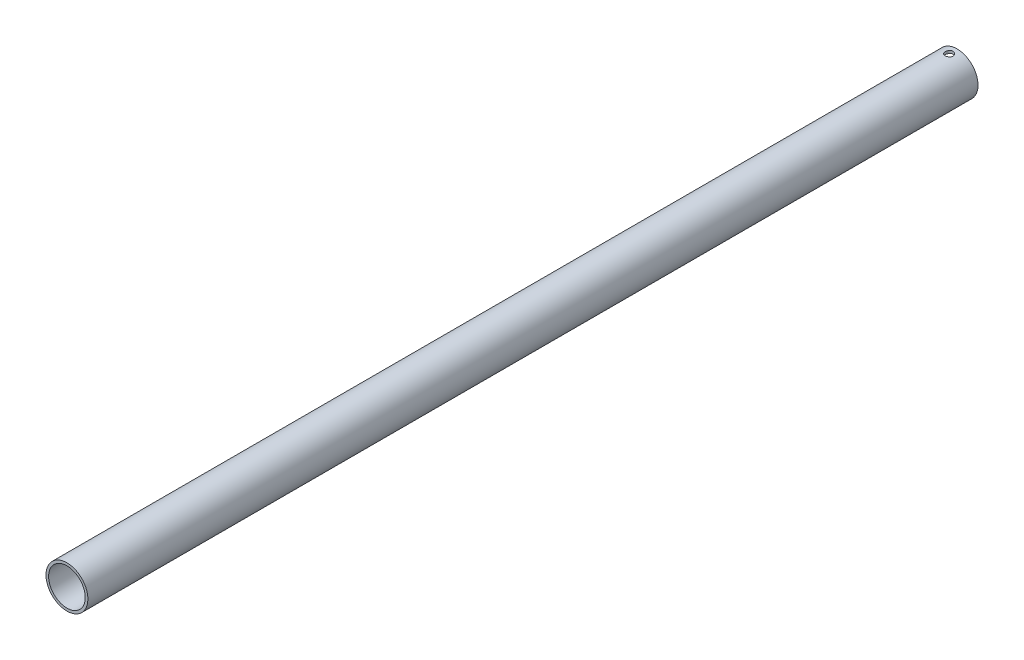
ISO-10303-21;
HEADER;
FILE_DESCRIPTION(('STEP AP214'),'2;1');
FILE_NAME('part.step','',(''),(''),'','','');
FILE_SCHEMA(('AUTOMOTIVE_DESIGN { 1 0 10303 214 1 1 1 1 }'));
ENDSEC;
DATA;
#1=APPLICATION_CONTEXT('core data for automotive mechanical design processes');
#2=APPLICATION_PROTOCOL_DEFINITION('international standard','automotive_design',2000,#1);
#3=PRODUCT_CONTEXT('',#1,'mechanical');
#4=PRODUCT('Part','Part','',(#3));
#5=PRODUCT_RELATED_PRODUCT_CATEGORY('part','',(#4));
#6=PRODUCT_DEFINITION_FORMATION('','',#4);
#7=PRODUCT_DEFINITION_CONTEXT('part definition',#1,'design');
#8=PRODUCT_DEFINITION('design','',#6,#7);
#9=PRODUCT_DEFINITION_SHAPE('','',#8);
#10=(LENGTH_UNIT() NAMED_UNIT(*) SI_UNIT(.MILLI.,.METRE.));
#11=(NAMED_UNIT(*) PLANE_ANGLE_UNIT() SI_UNIT($,.RADIAN.));
#12=(NAMED_UNIT(*) SI_UNIT($,.STERADIAN.) SOLID_ANGLE_UNIT());
#13=UNCERTAINTY_MEASURE_WITH_UNIT(LENGTH_MEASURE(1.E-05),#10,'distance_accuracy_value','');
#14=(GEOMETRIC_REPRESENTATION_CONTEXT(3) GLOBAL_UNCERTAINTY_ASSIGNED_CONTEXT((#13)) GLOBAL_UNIT_ASSIGNED_CONTEXT((#10,
#11,#12)) REPRESENTATION_CONTEXT('',''));
#15=CARTESIAN_POINT('',(0.,0.,0.));
#16=DIRECTION('',(0.,0.,1.));
#17=DIRECTION('',(1.,0.,0.));
#18=AXIS2_PLACEMENT_3D('',#15,#16,#17);
#19=CARTESIAN_POINT('',(0.,0.,240.));
#20=DIRECTION('',(0.,0.,-1.));
#21=DIRECTION('',(0.,1.,0.));
#22=AXIS2_PLACEMENT_3D('',#19,#20,#21);
#23=CYLINDRICAL_SURFACE('',#22,7.);
#24=CARTESIAN_POINT('',(0.,6.99999999999933,-95.44));
#25=CARTESIAN_POINT('',(0.0832358860906152,6.99999846043159,-95.4400028995743));
#26=CARTESIAN_POINT('',(0.166507195600273,6.99850025949644,-95.4469516083879));
#27=CARTESIAN_POINT('',(0.330687344293326,6.99266829827661,-95.4745356568536));
#28=CARTESIAN_POINT('',(0.411594403571189,6.98833245637033,-95.4951810441949));
#29=CARTESIAN_POINT('',(0.568649323817735,6.9773083178876,-95.549484364608));
#30=CARTESIAN_POINT('',(0.644801963446553,6.97062242967104,-95.5831289793813));
#31=CARTESIAN_POINT('',(0.790378177960784,6.95562106817904,-95.6624340861713));
#32=CARTESIAN_POINT('',(0.859801981747366,6.94730565036594,-95.7080941692499));
#33=CARTESIAN_POINT('',(0.991024790535224,6.92981369246244,-95.8108802996735));
#34=CARTESIAN_POINT('',(1.05270503419444,6.92062683143193,-95.8681562218985));
#35=CARTESIAN_POINT('',(1.16566042389434,6.90250069814078,-95.9922263156852));
#36=CARTESIAN_POINT('',(1.21693467150908,6.89356144731564,-96.0590213082512));
#37=CARTESIAN_POINT('',(1.30814204379809,6.87684116047158,-96.2011057528604));
#38=CARTESIAN_POINT('',(1.34794958335009,6.86907336344293,-96.2764775177562));
#39=CARTESIAN_POINT('',(1.41428823691148,6.8557232555847,-96.4330344537669));
#40=CARTESIAN_POINT('',(1.44082087001716,6.85014069470644,-96.5142189584926));
#41=CARTESIAN_POINT('',(1.47946574422454,6.84189808926244,-96.6788110865881));
#42=CARTESIAN_POINT('',(1.49178779748342,6.8391955689642,-96.7621672756639));
#43=CARTESIAN_POINT('',(1.50231395206577,6.83689139845039,-96.929804232507));
#44=CARTESIAN_POINT('',(1.50051971664629,6.83728938291662,-97.0140848901799));
#45=CARTESIAN_POINT('',(1.48303326340861,6.84110276603765,-97.1796246879338));
#46=CARTESIAN_POINT('',(1.46758398649408,6.84446541682095,-97.2609108891002));
#47=CARTESIAN_POINT('',(1.42361054298677,6.85374593375721,-97.4197102402893));
#48=CARTESIAN_POINT('',(1.39508566936466,6.85966393808335,-97.4972231860323));
#49=CARTESIAN_POINT('',(1.32554551075991,6.87344080755657,-97.6469628728733));
#50=CARTESIAN_POINT('',(1.2844361097283,6.88131420983298,-97.7191445127125));
#51=CARTESIAN_POINT('',(1.19096007283993,6.89810572501221,-97.855675164958));
#52=CARTESIAN_POINT('',(1.13859196103562,6.90702397481829,-97.9200231486862));
#53=CARTESIAN_POINT('',(1.0227954275532,6.92512718393811,-98.0404593556734));
#54=CARTESIAN_POINT('',(0.95916023396441,6.93431383972111,-98.0963487065847));
#55=CARTESIAN_POINT('',(0.823317306269097,6.95175017496992,-98.1966937336897));
#56=CARTESIAN_POINT('',(0.751109428775401,6.95999983875905,-98.2411492186004));
#57=CARTESIAN_POINT('',(0.599933462049961,6.97465778533936,-98.3174106799069));
#58=CARTESIAN_POINT('',(0.520952258863484,6.98106238643287,-98.349191412578));
#59=CARTESIAN_POINT('',(0.358603146685708,6.99128109245267,-98.3989756483211));
#60=CARTESIAN_POINT('',(0.275235851133671,6.99509555860316,-98.4169810725633));
#61=CARTESIAN_POINT('',(0.108187670836632,6.99965306347741,-98.4384162141434));
#62=CARTESIAN_POINT('',(0.0245431772716172,7.00045336520999,-98.4421177128818));
#63=CARTESIAN_POINT('',(-0.142168973650402,6.99905248935902,-98.4355754288748));
#64=CARTESIAN_POINT('',(-0.225236668127253,6.99685150675631,-98.425332552037));
#65=CARTESIAN_POINT('',(-0.387542537982803,6.98973143045199,-98.3914177563383));
#66=CARTESIAN_POINT('',(-0.466811712908474,6.98484105045392,-98.3678876305275));
#67=CARTESIAN_POINT('',(-0.620278450473415,6.97288924421443,-98.3082230570052));
#68=CARTESIAN_POINT('',(-0.694475592587738,6.9658276382217,-98.2720875656883));
#69=CARTESIAN_POINT('',(-0.836821397964753,6.95017504390333,-98.1876664569397));
#70=CARTESIAN_POINT('',(-0.904872575111139,6.94156431354208,-98.1392202050903));
#71=CARTESIAN_POINT('',(-1.0319769255236,6.9238103303478,-98.0317651751113));
#72=CARTESIAN_POINT('',(-1.091028978692,6.9146670114203,-97.9727550841126));
#73=CARTESIAN_POINT('',(-1.19952711057989,6.89668172706257,-97.8446026298129));
#74=CARTESIAN_POINT('',(-1.24878537255157,6.88784792221218,-97.7752999007779));
#75=CARTESIAN_POINT('',(-1.33496415386041,6.87166654559614,-97.629245403522));
#76=CARTESIAN_POINT('',(-1.37188519913706,6.86431891047988,-97.5524939530225));
#77=CARTESIAN_POINT('',(-1.43209741248548,6.85201009807323,-97.3941277010054));
#78=CARTESIAN_POINT('',(-1.45546398641275,6.847035745829,-97.3125426435693));
#79=CARTESIAN_POINT('',(-1.48812696085335,6.84001186708351,-97.1464844161664));
#80=CARTESIAN_POINT('',(-1.49742550780258,6.83796189439639,-97.0620116887987));
#81=CARTESIAN_POINT('',(-1.5015999992604,6.83704618848089,-96.8944676568247));
#82=CARTESIAN_POINT('',(-1.49677347258311,6.83811476518476,-96.8114039850194));
#83=CARTESIAN_POINT('',(-1.4734978940633,6.84316763184764,-96.6473027578674));
#84=CARTESIAN_POINT('',(-1.45504898957979,6.84715189026647,-96.5662651806134));
#85=CARTESIAN_POINT('',(-1.40519345940433,6.85755581104091,-96.4087413421308));
#86=CARTESIAN_POINT('',(-1.37382847170886,6.86396764224636,-96.3322413513357));
#87=CARTESIAN_POINT('',(-1.299067515956,6.87850764590582,-96.1855446274931));
#88=CARTESIAN_POINT('',(-1.25567035301499,6.88663598880296,-96.1153485213849));
#89=CARTESIAN_POINT('',(-1.15708290349303,6.90389055593165,-95.9817818062746));
#90=CARTESIAN_POINT('',(-1.10167987421236,6.9130330993886,-95.918570304053));
#91=CARTESIAN_POINT('',(-0.98108655461962,6.93117449799628,-95.8022437374795));
#92=CARTESIAN_POINT('',(-0.915894009385598,6.9401733195123,-95.7491310056878));
#93=CARTESIAN_POINT('',(-0.776603147268723,6.9571449104892,-95.6538840404944));
#94=CARTESIAN_POINT('',(-0.70240484600965,6.9651036457056,-95.611893393769));
#95=CARTESIAN_POINT('',(-0.547850160940609,6.97895826103952,-95.5410454710938));
#96=CARTESIAN_POINT('',(-0.46749910586389,6.98485590212276,-95.512176977415));
#97=CARTESIAN_POINT('',(-0.322535217553211,6.99284848461705,-95.4736478148689));
#98=CARTESIAN_POINT('',(-0.258717205545984,6.99551391888197,-95.46105356602));
#99=CARTESIAN_POINT('',(-0.129939960853849,6.99909024154653,-95.4442286982883));
#100=CARTESIAN_POINT('',(-0.064980775088747,7.00000120191248,-95.4399977363539));
#101=CARTESIAN_POINT('',(0.,6.99999999999933,-95.44));
#102=B_SPLINE_CURVE_WITH_KNOTS('',3,(#24,#25,#26,#27,#28,#29,#30,#31,#32,#33,#34,#35,#36,#37,
#38,#39,#40,#41,#42,#43,#44,#45,#46,#47,#48,#49,#50,#51,#52,#53,#54,#55,#56,#57,#58,#59,#60,#61,
#62,#63,#64,#65,#66,#67,#68,#69,#70,#71,#72,#73,#74,#75,#76,#77,#78,#79,#80,#81,#82,#83,#84,#85,
#86,#87,#88,#89,#90,#91,#92,#93,#94,#95,#96,#97,#98,#99,#100,#101),.UNSPECIFIED.,.T.,.F.,(4,2,2,
2,2,2,2,2,2,2,2,2,2,2,2,2,2,2,2,2,2,2,2,2,2,2,2,2,2,2,2,2,2,2,2,2,2,2,4),(0.,0.249469836512082,
0.499122883219935,0.748520824425598,0.99791027864588,1.25074961881731,1.50361077918506,
1.75914429214511,2.01464855677492,2.26633008124666,2.51798195169165,2.76524475452929,
3.01252092904568,3.26169356165967,3.51089887920889,3.76527011050291,4.0196455970235,
4.27452521139806,4.52936927256343,4.77934665704185,5.02930780231429,5.27665060589267,
5.52401389198434,5.77478733867803,6.02559197304485,6.28082063283534,6.53603841075806,
6.78982240408475,7.04356767229186,7.29200680540296,7.5404432510827,7.78808499706786,
8.03575134451625,8.28822950154114,8.54076590397114,8.79641910357221,9.0518533401027,
9.24661799132293,9.44137465337336),.UNSPECIFIED.);
#103=CARTESIAN_POINT('',(0.,6.99999999999933,-95.44));
#104=VERTEX_POINT('',#103);
#105=EDGE_CURVE('E85',#104,#104,#102,.T.);
#106=ORIENTED_EDGE('',*,*,#105,.T.);
#107=EDGE_LOOP('',(#106));
#108=FACE_BOUND('',#107,.T.);
#109=CARTESIAN_POINT('',(0.,-3.79690197153943E-13,-100.));
#110=DIRECTION('',(0.,0.,-1.));
#111=DIRECTION('',(0.,1.,0.));
#112=AXIS2_PLACEMENT_3D('',#109,#110,#111);
#113=CIRCLE('',#112,7.);
#114=CARTESIAN_POINT('',(0.,6.99999999999962,-100.));
#115=VERTEX_POINT('',#114);
#116=EDGE_CURVE('E91',#115,#115,#113,.T.);
#117=ORIENTED_EDGE('',*,*,#116,.T.);
#118=EDGE_LOOP('',(#117));
#119=FACE_BOUND('',#118,.T.);
#120=CARTESIAN_POINT('',(-1.5,-6.83739716558934,-96.94));
#121=CARTESIAN_POINT('',(-1.49999708238613,-6.83739884559018,-97.0232111524819));
#122=CARTESIAN_POINT('',(-1.49305236244768,-6.83893272341996,-97.1064577739421));
#123=CARTESIAN_POINT('',(-1.46548559252999,-6.84489178429934,-97.270586672242));
#124=CARTESIAN_POINT('',(-1.44485339653621,-6.84931911211908,-97.3514671486762));
#125=CARTESIAN_POINT('',(-1.39058863684599,-6.86054115293476,-97.5084657495742));
#126=CARTESIAN_POINT('',(-1.35697000991314,-6.86733332725892,-97.5845888781215));
#127=CARTESIAN_POINT('',(-1.2777261767334,-6.88251670848711,-97.7301152739446));
#128=CARTESIAN_POINT('',(-1.23210132048775,-6.89090786877612,-97.7995187370291));
#129=CARTESIAN_POINT('',(-1.1293514257022,-6.90849578796721,-97.9307629614821));
#130=CARTESIAN_POINT('',(-1.07206859483982,-6.9177024987182,-97.99247887624));
#131=CARTESIAN_POINT('',(-0.947969508129571,-6.93579691710464,-98.1055035544058));
#132=CARTESIAN_POINT('',(-0.88115253021767,-6.94468460051484,-98.1568115288601));
#133=CARTESIAN_POINT('',(-0.739047288464578,-6.96124769109499,-98.2480554444914));
#134=CARTESIAN_POINT('',(-0.66368048822995,-6.96890998819496,-98.2878716557706));
#135=CARTESIAN_POINT('',(-0.507134269342593,-6.98204671043001,-98.3542276914463));
#136=CARTESIAN_POINT('',(-0.425955477380311,-6.98752137103396,-98.3807689447863));
#137=CARTESIAN_POINT('',(-0.261387187671511,-6.99559565281247,-98.4194299709313));
#138=CARTESIAN_POINT('',(-0.178049400596922,-6.99823733378452,-98.4317609285524));
#139=CARTESIAN_POINT('',(-0.0104489453066434,-7.00049362207069,-98.4423112773133));
#140=CARTESIAN_POINT('',(0.0738136201647602,-7.00010856232766,-98.4405322205607));
#141=CARTESIAN_POINT('',(0.239417029250513,-6.99638700862625,-98.4230710353364));
#142=CARTESIAN_POINT('',(0.320783115362115,-6.99309883152499,-98.4076164997101));
#143=CARTESIAN_POINT('',(0.479739463978392,-6.98399541589172,-98.3636053181481));
#144=CARTESIAN_POINT('',(0.557329560175057,-6.97818006616585,-98.3350480957002));
#145=CARTESIAN_POINT('',(0.707167497556558,-6.96459754646925,-98.2654385411115));
#146=CARTESIAN_POINT('',(0.779373657015797,-6.95681685804013,-98.2242992327956));
#147=CARTESIAN_POINT('',(0.915940926562853,-6.94015793743932,-98.1307580318364));
#148=CARTESIAN_POINT('',(0.980301006451531,-6.9312795614476,-98.0783546626997));
#149=CARTESIAN_POINT('',(1.10070208800198,-6.91319326460992,-97.9625314554721));
#150=CARTESIAN_POINT('',(1.15655117320251,-6.9039823037292,-97.898912420643));
#151=CARTESIAN_POINT('',(1.25682243234728,-6.88643566832041,-97.7631167149315));
#152=CARTESIAN_POINT('',(1.30124432118069,-6.87810001563453,-97.6909398305947));
#153=CARTESIAN_POINT('',(1.37748077573297,-6.8632402358679,-97.5397754989362));
#154=CARTESIAN_POINT('',(1.40926035088923,-6.85672115127842,-97.4607698761476));
#155=CARTESIAN_POINT('',(1.45903495159115,-6.84630340806683,-97.2983672340536));
#156=CARTESIAN_POINT('',(1.47703206694628,-6.8424043521855,-97.2149708825568));
#157=CARTESIAN_POINT('',(1.49843586024652,-6.83774881255513,-97.0479042473503));
#158=CARTESIAN_POINT('',(1.5021214192864,-6.83693227051768,-96.9642713249227));
#159=CARTESIAN_POINT('',(1.49555139642373,-6.8383723957406,-96.7975860068183));
#160=CARTESIAN_POINT('',(1.48529673081635,-6.84062886101129,-96.7145335733464));
#161=CARTESIAN_POINT('',(1.45137894635584,-6.84790415484272,-96.5523295650192));
#162=CARTESIAN_POINT('',(1.42786830251553,-6.85289155274431,-96.473144567403));
#163=CARTESIAN_POINT('',(1.36827052946749,-6.86503859869844,-96.3198376624671));
#164=CARTESIAN_POINT('',(1.33218223662818,-6.87219844772916,-96.2457162243658));
#165=CARTESIAN_POINT('',(1.24783504416705,-6.88801634080412,-96.1034303152411));
#166=CARTESIAN_POINT('',(1.19940368590792,-6.89669501746383,-96.0353704179878));
#167=CARTESIAN_POINT('',(1.091971838336,-6.91451775360206,-95.9082416541262));
#168=CARTESIAN_POINT('',(1.03297009182161,-6.92366186834528,-95.8491738585515));
#169=CARTESIAN_POINT('',(0.904812764420809,-6.9415823999024,-95.7406296970552));
#170=CARTESIAN_POINT('',(0.835494925828762,-6.95034935607813,-95.691343083843));
#171=CARTESIAN_POINT('',(0.689401481282266,-6.96635610714968,-95.605114590649));
#172=CARTESIAN_POINT('',(0.61262621604373,-6.97359597176759,-95.5681721470272));
#173=CARTESIAN_POINT('',(0.454265418982032,-6.98569278381641,-95.5079479453615));
#174=CARTESIAN_POINT('',(0.372713193075164,-6.99056443803764,-95.4845816962537));
#175=CARTESIAN_POINT('',(0.206725177003281,-6.99743939302047,-95.4519082942677));
#176=CARTESIAN_POINT('',(0.122289789973985,-6.99944309312362,-95.4425991840261));
#177=CARTESIAN_POINT('',(-0.0452637170528369,-7.00034511009123,-95.4383893475881));
#178=CARTESIAN_POINT('',(-0.128374505509237,-6.99930459001734,-95.4432048413954));
#179=CARTESIAN_POINT('',(-0.292572938415966,-6.99436552363449,-95.466474763519));
#180=CARTESIAN_POINT('',(-0.37366061640529,-6.99046702473752,-95.4849289655783));
#181=CARTESIAN_POINT('',(-0.531301948487272,-6.98025388638603,-95.5348188062495));
#182=CARTESIAN_POINT('',(-0.607868365073178,-6.97394646430559,-95.5662156893856));
#183=CARTESIAN_POINT('',(-0.754684956723221,-6.95959036050727,-95.6410612711691));
#184=CARTESIAN_POINT('',(-0.824934544796144,-6.95154151720407,-95.684511088306));
#185=CARTESIAN_POINT('',(-0.95851230689525,-6.9343980993456,-95.7831623187427));
#186=CARTESIAN_POINT('',(-1.02169036510578,-6.92528708907941,-95.8385641583213));
#187=CARTESIAN_POINT('',(-1.13795001457643,-6.90713690075903,-95.9591406102503));
#188=CARTESIAN_POINT('',(-1.19102918062422,-6.89809774045749,-96.0243175633556));
#189=CARTESIAN_POINT('',(-1.28623261596675,-6.88098693651982,-96.1635904931857));
#190=CARTESIAN_POINT('',(-1.32820897809617,-6.872929059566,-96.237789358287));
#191=CARTESIAN_POINT('',(-1.39903004659826,-6.85886497228115,-96.3923437209233));
#192=CARTESIAN_POINT('',(-1.42788606423931,-6.8528569958164,-96.4726938452531));
#193=CARTESIAN_POINT('',(-1.46638607121558,-6.84470560642063,-96.6176261311859));
#194=CARTESIAN_POINT('',(-1.47896752507743,-6.84198283088019,-96.6814116757078));
#195=CARTESIAN_POINT('',(-1.49577544043437,-6.83832799504472,-96.8101243115773));
#196=CARTESIAN_POINT('',(-1.50000227727981,-6.83739585430136,-96.8750513515083));
#197=CARTESIAN_POINT('',(-1.5,-6.83739716558934,-96.94));
#198=B_SPLINE_CURVE_WITH_KNOTS('',3,(#120,#121,#122,#123,#124,#125,#126,#127,#128,#129,#130,
#131,#132,#133,#134,#135,#136,#137,#138,#139,#140,#141,#142,#143,#144,#145,#146,#147,#148,#149,
#150,#151,#152,#153,#154,#155,#156,#157,#158,#159,#160,#161,#162,#163,#164,#165,#166,#167,#168,
#169,#170,#171,#172,#173,#174,#175,#176,#177,#178,#179,#180,#181,#182,#183,#184,#185,#186,#187,
#188,#189,#190,#191,#192,#193,#194,#195,#196,#197),.UNSPECIFIED.,.T.,.F.,(4,2,2,2,2,2,2,2,2,2,2,
2,2,2,2,2,2,2,2,2,2,2,2,2,2,2,2,2,2,2,2,2,2,2,2,2,2,2,4),(0.,0.249395482027555,
0.498976038479968,0.748289491152764,0.997595676735293,1.25053229582693,1.50348808112879,
1.75899134820279,2.01446710646268,2.26609508151929,2.51769537777241,2.76518557667372,
3.01268666607584,3.26193888143438,3.51122378872315,3.76548960779295,4.01976177023092,
4.27473287411779,4.52966530953839,4.77960433192523,5.02952692653916,5.27663180749376,
5.5237595556315,5.77455010216317,6.02537049659078,6.2806621468321,6.53594213875542,
6.78961589824376,7.04325433208539,7.29183199644127,7.54040553715099,7.78824009619482,
8.03609766151365,8.28848914160965,8.54094115631233,8.79660380167249,9.05204561611688,
9.24671456122271,9.44137476018022),.UNSPECIFIED.);
#199=CARTESIAN_POINT('',(-1.5,-6.83739716558934,-96.94));
#200=VERTEX_POINT('',#199);
#201=EDGE_CURVE('E44',#200,#200,#198,.T.);
#202=ORIENTED_EDGE('',*,*,#201,.T.);
#203=EDGE_LOOP('',(#202));
#204=FACE_BOUND('',#203,.T.);
#205=CARTESIAN_POINT('',(0.,0.,240.));
#206=DIRECTION('',(0.,0.,-1.));
#207=DIRECTION('',(0.,1.,0.));
#208=AXIS2_PLACEMENT_3D('',#205,#206,#207);
#209=CIRCLE('',#208,7.);
#210=CARTESIAN_POINT('',(0.,7.,240.));
#211=VERTEX_POINT('',#210);
#212=EDGE_CURVE('E92',#211,#211,#209,.T.);
#213=ORIENTED_EDGE('',*,*,#212,.F.);
#214=EDGE_LOOP('',(#213));
#215=FACE_BOUND('',#214,.T.);
#216=ADVANCED_FACE('F40',(#108,#119,#204,#215),#23,.F.);
#217=CARTESIAN_POINT('',(-8.096,-8.096,240.));
#218=DIRECTION('',(0.,0.,1.));
#219=DIRECTION('',(1.,0.,0.));
#220=AXIS2_PLACEMENT_3D('',#217,#218,#219);
#221=PLANE('',#220);
#222=CARTESIAN_POINT('',(0.,0.,240.));
#223=DIRECTION('',(0.,0.,-1.));
#224=DIRECTION('',(0.,1.,0.));
#225=AXIS2_PLACEMENT_3D('',#222,#223,#224);
#226=CIRCLE('',#225,8.);
#227=CARTESIAN_POINT('',(0.,8.,240.));
#228=VERTEX_POINT('',#227);
#229=EDGE_CURVE('E97',#228,#228,#226,.T.);
#230=ORIENTED_EDGE('',*,*,#229,.F.);
#231=EDGE_LOOP('',(#230));
#232=FACE_BOUND('',#231,.T.);
#233=ORIENTED_EDGE('',*,*,#212,.T.);
#234=EDGE_LOOP('',(#233));
#235=FACE_BOUND('',#234,.T.);
#236=ADVANCED_FACE('F75',(#232,#235),#221,.T.);
#237=CARTESIAN_POINT('',(0.,6.83040772669209,-96.94));
#238=DIRECTION('',(0.,1.,0.));
#239=DIRECTION('',(0.,0.,1.));
#240=AXIS2_PLACEMENT_3D('',#237,#238,#239);
#241=CYLINDRICAL_SURFACE('',#240,1.5);
#242=ORIENTED_EDGE('',*,*,#105,.F.);
#243=EDGE_LOOP('',(#242));
#244=FACE_BOUND('',#243,.T.);
#245=CARTESIAN_POINT('',(0.,7.99999999999941,-98.44));
#246=CARTESIAN_POINT('',(0.0834717464654703,7.99999848833793,-98.4399968104117));
#247=CARTESIAN_POINT('',(0.166984992730098,7.99868009921656,-98.4330089233806));
#248=CARTESIAN_POINT('',(0.331658129841797,7.99354785890461,-98.4052600048816));
#249=CARTESIAN_POINT('',(0.412815974152226,7.98973190166838,-98.3844873493603));
#250=CARTESIAN_POINT('',(0.570372961851802,7.98003138765399,-98.3298272987407));
#251=CARTESIAN_POINT('',(0.646776330685344,7.97414869946424,-98.2959517475475));
#252=CARTESIAN_POINT('',(0.792807973094008,7.96095710599725,-98.2160811230772));
#253=CARTESIAN_POINT('',(0.862436794477326,7.95364831618231,-98.1700870308552));
#254=CARTESIAN_POINT('',(0.993783715930507,7.93831336430446,-98.0667002319963));
#255=CARTESIAN_POINT('',(1.05540895503184,7.93028034856293,-98.0091905553299));
#256=CARTESIAN_POINT('',(1.16819606135369,7.91445318458592,-97.8846566909124));
#257=CARTESIAN_POINT('',(1.21935717689242,7.90665905354469,-97.8176318202307));
#258=CARTESIAN_POINT('',(1.31014998665793,7.89212551244947,-97.675313911636));
#259=CARTESIAN_POINT('',(1.34968721969606,7.88539493886123,-97.5999596296828));
#260=CARTESIAN_POINT('',(1.41550524332283,7.87384713211929,-97.4435310848232));
#261=CARTESIAN_POINT('',(1.44178717713098,7.86902973396904,-97.3624573158888));
#262=CARTESIAN_POINT('',(1.480050535035,7.86192269574492,-97.1978847690856));
#263=CARTESIAN_POINT('',(1.49219390192039,7.85960445366346,-97.1144249027965));
#264=CARTESIAN_POINT('',(1.50233808095346,7.85767197152703,-96.9466226151917));
#265=CARTESIAN_POINT('',(1.50034016135374,7.85805748898701,-96.8622802736977));
#266=CARTESIAN_POINT('',(1.48238979602362,7.86146292701694,-96.6962804747339));
#267=CARTESIAN_POINT('',(1.46662149996045,7.86444808147276,-96.6146022856998));
#268=CARTESIAN_POINT('',(1.42186799396207,7.87266183284608,-96.4550715802174));
#269=CARTESIAN_POINT('',(1.39288222239499,7.87789052509458,-96.3772192264907));
#270=CARTESIAN_POINT('',(1.322336471793,7.8900385529253,-96.2270113209997));
#271=CARTESIAN_POINT('',(1.28070213532456,7.89696783823307,-96.1546915294192));
#272=CARTESIAN_POINT('',(1.18609368930416,7.9117297160286,-96.0179952714598));
#273=CARTESIAN_POINT('',(1.13311842889266,7.91956240015464,-95.9536196122852));
#274=CARTESIAN_POINT('',(1.01633905685297,7.93540001272106,-95.8335750443275));
#275=CARTESIAN_POINT('',(0.952377436860679,7.94340571023972,-95.7780593475483));
#276=CARTESIAN_POINT('',(0.815968037098827,7.9585738610826,-95.6785227593246));
#277=CARTESIAN_POINT('',(0.743520172255771,7.96573630595187,-95.6345019831296));
#278=CARTESIAN_POINT('',(0.592034988874671,7.9784253967745,-95.55918224613));
#279=CARTESIAN_POINT('',(0.512989564446496,7.98394999136231,-95.5278992208821));
#280=CARTESIAN_POINT('',(0.350639115398697,7.99272505402661,-95.4790979069078));
#281=CARTESIAN_POINT('',(0.267334544277787,7.99597576367936,-95.4615781559546));
#282=CARTESIAN_POINT('',(0.100148652903384,7.99980360641922,-95.4410139689817));
#283=CARTESIAN_POINT('',(0.0162940126341336,8.00041950912221,-95.4377596084703));
#284=CARTESIAN_POINT('',(-0.150761248092186,7.9990154359817,-95.4452554795476));
#285=CARTESIAN_POINT('',(-0.233961900480388,7.99699558964373,-95.4560050230653));
#286=CARTESIAN_POINT('',(-0.396681573218219,7.99057111500348,-95.4910290351834));
#287=CARTESIAN_POINT('',(-0.476224261046065,7.98618522373973,-95.5151972825378));
#288=CARTESIAN_POINT('',(-0.630128631824635,7.9755184221244,-95.5762577067788));
#289=CARTESIAN_POINT('',(-0.704489962595105,7.96923738311276,-95.6131507475658));
#290=CARTESIAN_POINT('',(-0.846816671513212,7.95538030357608,-95.6990781281595));
#291=CARTESIAN_POINT('',(-0.914703277015114,7.94779086174504,-95.7482407385368));
#292=CARTESIAN_POINT('',(-1.04133832326454,7.93219343489653,-95.8571381373624));
#293=CARTESIAN_POINT('',(-1.10008590976086,7.92418541084629,-95.9168739130013));
#294=CARTESIAN_POINT('',(-1.20757295872048,7.90852475697392,-96.0461723189114));
#295=CARTESIAN_POINT('',(-1.25616916218577,7.90087825860199,-96.1158549081254));
#296=CARTESIAN_POINT('',(-1.34096675057787,7.88692985578474,-96.2625176245238));
#297=CARTESIAN_POINT('',(-1.37716859613924,7.88062790137291,-96.3394974803705));
#298=CARTESIAN_POINT('',(-1.43594673512823,7.87013024209515,-96.4982058672425));
#299=CARTESIAN_POINT('',(-1.45858868794786,7.8659244043682,-96.5799093795594));
#300=CARTESIAN_POINT('',(-1.48980679326235,7.86007203802357,-96.7460472225214));
#301=CARTESIAN_POINT('',(-1.49838453270708,7.85842522065731,-96.8304812439704));
#302=CARTESIAN_POINT('',(-1.50117762148355,7.85789199803799,-96.9982483314415));
#303=CARTESIAN_POINT('',(-1.49561895003499,7.85896215974235,-97.081577580957));
#304=CARTESIAN_POINT('',(-1.47079175378803,7.8636460065994,-97.2460914220453));
#305=CARTESIAN_POINT('',(-1.45152331089332,7.86725967655688,-97.3272760264274));
#306=CARTESIAN_POINT('',(-1.39991887583263,7.87660508023121,-97.4850744847955));
#307=CARTESIAN_POINT('',(-1.36760735397253,7.88233284594906,-97.5616965913457));
#308=CARTESIAN_POINT('',(-1.29085868912205,7.89526387551781,-97.7084682542408));
#309=CARTESIAN_POINT('',(-1.24642068948187,7.90246724360061,-97.7786173528448));
#310=CARTESIAN_POINT('',(-1.14589487339536,7.91767266107686,-97.9115836800423));
#311=CARTESIAN_POINT('',(-1.08964259864304,7.92568505352985,-97.9742754125671));
#312=CARTESIAN_POINT('',(-0.967427926742295,7.94152833918677,-98.0894051624645));
#313=CARTESIAN_POINT('',(-0.90146330189162,7.94935919027269,-98.1418408209801));
#314=CARTESIAN_POINT('',(-0.760984945071876,7.9640397596799,-98.235410952627));
#315=CARTESIAN_POINT('',(-0.686399590640518,7.97088000990502,-98.2764394284906));
#316=CARTESIAN_POINT('',(-0.53129011365383,7.98271619380628,-98.3453176366051));
#317=CARTESIAN_POINT('',(-0.450771651705242,7.98771385878978,-98.3731797470469));
#318=CARTESIAN_POINT('',(-0.308347202825147,7.99428290707573,-98.4092773144187));
#319=CARTESIAN_POINT('',(-0.247273810251866,7.99641470878148,-98.4207786303128));
#320=CARTESIAN_POINT('',(-0.124141247115156,7.99927379953952,-98.4361410621164));
#321=CARTESIAN_POINT('',(-0.0620821016527088,8.00000112429746,-98.4400023722559));
#322=CARTESIAN_POINT('',(0.,7.99999999999941,-98.44));
#323=B_SPLINE_CURVE_WITH_KNOTS('',3,(#245,#246,#247,#248,#249,#250,#251,#252,#253,#254,#255,
#256,#257,#258,#259,#260,#261,#262,#263,#264,#265,#266,#267,#268,#269,#270,#271,#272,#273,#274,
#275,#276,#277,#278,#279,#280,#281,#282,#283,#284,#285,#286,#287,#288,#289,#290,#291,#292,#293,
#294,#295,#296,#297,#298,#299,#300,#301,#302,#303,#304,#305,#306,#307,#308,#309,#310,#311,#312,
#313,#314,#315,#316,#317,#318,#319,#320,#321,#322),.UNSPECIFIED.,.T.,.F.,(4,2,2,2,2,2,2,2,2,2,2,
2,2,2,2,2,2,2,2,2,2,2,2,2,2,2,2,2,2,2,2,2,2,2,2,2,2,2,4),(0.,0.250188200964925,
0.500587642535452,0.750761271230907,1.00091465336891,1.25375118013632,1.50660586283617,
1.76146190504358,2.01629596311948,2.26818151445336,2.52004447587256,2.76859000612767,
3.01714609846787,3.2671926262953,3.5172645404986,3.77127768464077,4.02529337544947,
4.27962588321699,4.53393136673745,4.78448174076097,5.03501980464584,5.28360233907829,
5.53220175338032,5.78351778017708,6.03485728413098,6.289534369873,6.54420198954946,
6.7976262781856,7.05102196946513,7.30039252231747,7.54976158541506,7.7986649620769,
8.04758592655422,8.30023369966379,8.55293951262255,8.80792048916315,9.06266126931174,
9.24874344524409,9.4348208903954),.UNSPECIFIED.);
#324=CARTESIAN_POINT('',(0.,7.99999999999941,-98.44));
#325=VERTEX_POINT('',#324);
#326=EDGE_CURVE('E56',#325,#325,#323,.T.);
#327=ORIENTED_EDGE('',*,*,#326,.F.);
#328=EDGE_LOOP('',(#327));
#329=FACE_BOUND('',#328,.T.);
#330=ADVANCED_FACE('F78',(#244,#329),#241,.F.);
#331=CARTESIAN_POINT('',(-8.096,-8.09599999999991,-100.));
#332=DIRECTION('',(0.,0.,1.));
#333=DIRECTION('',(1.,0.,0.));
#334=AXIS2_PLACEMENT_3D('',#331,#332,#333);
#335=PLANE('',#334);
#336=CARTESIAN_POINT('',(0.,-3.20213963691881E-13,-100.));
#337=DIRECTION('',(0.,0.,-1.));
#338=DIRECTION('',(0.,1.,0.));
#339=AXIS2_PLACEMENT_3D('',#336,#337,#338);
#340=CIRCLE('',#339,8.);
#341=CARTESIAN_POINT('',(0.,7.99999999999968,-100.));
#342=VERTEX_POINT('',#341);
#343=EDGE_CURVE('E52',#342,#342,#340,.F.);
#344=ORIENTED_EDGE('',*,*,#343,.F.);
#345=EDGE_LOOP('',(#344));
#346=FACE_BOUND('',#345,.T.);
#347=ORIENTED_EDGE('',*,*,#116,.F.);
#348=EDGE_LOOP('',(#347));
#349=FACE_BOUND('',#348,.T.);
#350=ADVANCED_FACE('F42',(#346,#349),#335,.F.);
#351=CARTESIAN_POINT('',(0.,-8.00697569950275,-96.94));
#352=DIRECTION('',(0.,1.,0.));
#353=DIRECTION('',(-1.,0.,0.));
#354=AXIS2_PLACEMENT_3D('',#351,#352,#353);
#355=CYLINDRICAL_SURFACE('',#354,1.5);
#356=CARTESIAN_POINT('',(-1.5,-7.85811682275144,-96.94));
#357=CARTESIAN_POINT('',(-1.49999679883246,-7.85811843793552,-96.8565427919883));
#358=CARTESIAN_POINT('',(-1.49301126348936,-7.85946079760325,-96.7730440517816));
#359=CARTESIAN_POINT('',(-1.46527253251805,-7.86467851014423,-96.6084010384181));
#360=CARTESIAN_POINT('',(-1.44450765768477,-7.86855601173264,-96.5272588235725));
#361=CARTESIAN_POINT('',(-1.38987035617788,-7.87838976464943,-96.3697349286291));
#362=CARTESIAN_POINT('',(-1.35601013954374,-7.88434407906055,-96.2933488906927));
#363=CARTESIAN_POINT('',(-1.27617565760366,-7.89765826321017,-96.1473464407132));
#364=CARTESIAN_POINT('',(-1.23020233759194,-7.9050180232568,-96.0777295009967));
#365=CARTESIAN_POINT('',(-1.12683678942622,-7.92041614839003,-95.9463698008009));
#366=CARTESIAN_POINT('',(-1.06932292933091,-7.92846116625737,-95.8847235165283));
#367=CARTESIAN_POINT('',(-0.944771778803545,-7.94426457664092,-95.7718956104004));
#368=CARTESIAN_POINT('',(-0.87773386362494,-7.95202295031211,-95.7207146755752));
#369=CARTESIAN_POINT('',(-0.735403894570159,-7.96645017828463,-95.6299006233995));
#370=CARTESIAN_POINT('',(-0.66005284003386,-7.97311028052421,-95.5903584664806));
#371=CARTESIAN_POINT('',(-0.503631283250757,-7.98451608632989,-95.5245304577265));
#372=CARTESIAN_POINT('',(-0.422561251859502,-7.98926194728392,-95.4982435160098));
#373=CARTESIAN_POINT('',(-0.258002746187414,-7.99625755123836,-95.4599704513889));
#374=CARTESIAN_POINT('',(-0.174553323244855,-7.99853565976385,-95.4478216940773));
#375=CARTESIAN_POINT('',(-0.00677167603538179,-8.00043684615652,-95.4376631122996));
#376=CARTESIAN_POINT('',(0.0775604724476715,-8.00006015010755,-95.4396520838609));
#377=CARTESIAN_POINT('',(0.243598357899396,-7.996716337633,-95.4575877711472));
#378=CARTESIAN_POINT('',(0.325323760451467,-7.99378172247272,-95.47335936943));
#379=CARTESIAN_POINT('',(0.484947165715473,-7.98568826333619,-95.5181356493952));
#380=CARTESIAN_POINT('',(0.562845028826539,-7.98052933830024,-95.5471408133458));
#381=CARTESIAN_POINT('',(0.713110065751521,-7.96851260297398,-95.6177277310583));
#382=CARTESIAN_POINT('',(0.785443571838533,-7.96164537590884,-95.6593794879125));
#383=CARTESIAN_POINT('',(0.922159977214639,-7.94697147542908,-95.7540256690772));
#384=CARTESIAN_POINT('',(0.986542066910786,-7.93916470651222,-95.8070212468876));
#385=CARTESIAN_POINT('',(1.10656561896904,-7.92333513680625,-95.9238157029835));
#386=CARTESIAN_POINT('',(1.16205790757041,-7.9153108590168,-95.9877677839021));
#387=CARTESIAN_POINT('',(1.26155171851261,-7.90006508924679,-96.1241495312786));
#388=CARTESIAN_POINT('',(1.30555307271182,-7.89284360901409,-96.1965793217646));
#389=CARTESIAN_POINT('',(1.38085852224478,-7.8800189330718,-96.3480582707027));
#390=CARTESIAN_POINT('',(1.41214093645421,-7.8744185053032,-96.4271184571907));
#391=CARTESIAN_POINT('',(1.46093656975056,-7.86551242396748,-96.5895011841232));
#392=CARTESIAN_POINT('',(1.47845134901108,-7.86220651038678,-96.6728232404648));
#393=CARTESIAN_POINT('',(1.49899672649739,-7.85831520301064,-96.8400193288559));
#394=CARTESIAN_POINT('',(1.50224164285858,-7.85768955816195,-96.9238661155655));
#395=CARTESIAN_POINT('',(1.49472968881725,-7.85912191420898,-97.0909034550871));
#396=CARTESIAN_POINT('',(1.48397351086433,-7.8611797823867,-97.1740940401481));
#397=CARTESIAN_POINT('',(1.44894868195883,-7.86770980063264,-97.3367529030544));
#398=CARTESIAN_POINT('',(1.42479238583989,-7.87216186690937,-97.4162462526249));
#399=CARTESIAN_POINT('',(1.36377224379059,-7.88296134156677,-97.5700571897302));
#400=CARTESIAN_POINT('',(1.32690746128795,-7.8893088896334,-97.6443743953153));
#401=CARTESIAN_POINT('',(1.24102353119659,-7.90327577863744,-97.7866676190432));
#402=CARTESIAN_POINT('',(1.1918689963962,-7.91090895425374,-97.8545605378661));
#403=CARTESIAN_POINT('',(1.08298344344246,-7.92654811368159,-97.9812120402143));
#404=CARTESIAN_POINT('',(1.02325147433084,-7.93455413096552,-98.0399698015558));
#405=CARTESIAN_POINT('',(0.89394941787039,-7.95016624006005,-98.1474837635341));
#406=CARTESIAN_POINT('',(0.824258534095893,-7.95776555833364,-98.196095826606));
#407=CARTESIAN_POINT('',(0.67757452304014,-7.97159404810409,-98.2809212061777));
#408=CARTESIAN_POINT('',(0.600581677038529,-7.97782327234784,-98.317135000025));
#409=CARTESIAN_POINT('',(0.441877541578684,-7.98818057995906,-98.3759200978641));
#410=CARTESIAN_POINT('',(0.360193213078986,-7.99231954730201,-98.3985621875614));
#411=CARTESIAN_POINT('',(0.19409622738157,-7.99807642083803,-98.4297870482899));
#412=CARTESIAN_POINT('',(0.109683858215852,-7.99969459229992,-98.4383712986627));
#413=CARTESIAN_POINT('',(-0.0580907602505075,-8.00022227515499,-98.4411853015184));
#414=CARTESIAN_POINT('',(-0.141449307066267,-7.9991728662509,-98.4356327531295));
#415=CARTESIAN_POINT('',(-0.306023369279198,-7.99456866611761,-98.4108075722316));
#416=CARTESIAN_POINT('',(-0.387238905213688,-7.9910138989073,-98.3915350712558));
#417=CARTESIAN_POINT('',(-0.545106475595482,-7.98179837978104,-98.3399087926163));
#418=CARTESIAN_POINT('',(-0.62176631931822,-7.97614135981634,-98.307578187119));
#419=CARTESIAN_POINT('',(-0.768605631316691,-7.9633337206883,-98.2307795463448));
#420=CARTESIAN_POINT('',(-0.838784665003269,-7.95618300146541,-98.1863106978933));
#421=CARTESIAN_POINT('',(-0.971755027780002,-7.9410477986,-98.0857485455577));
#422=CARTESIAN_POINT('',(-1.03442623539052,-7.93305284591331,-98.0294979661383));
#423=CARTESIAN_POINT('',(-1.14951536065484,-7.91719633538892,-97.9072954375073));
#424=CARTESIAN_POINT('',(-1.2019308632478,-7.90933480936823,-97.8413412096263));
#425=CARTESIAN_POINT('',(-1.29547633945385,-7.89455577425984,-97.7008735452967));
#426=CARTESIAN_POINT('',(-1.33649740531871,-7.88764767280787,-97.6262865603324));
#427=CARTESIAN_POINT('',(-1.40536132423416,-7.87567084650092,-97.4711742100203));
#428=CARTESIAN_POINT('',(-1.43321661638912,-7.87060038649175,-97.3906545334106));
#429=CARTESIAN_POINT('',(-1.46929726596175,-7.86393016292183,-97.2482477119341));
#430=CARTESIAN_POINT('',(-1.48079105739851,-7.8617631071799,-97.187194276238));
#431=CARTESIAN_POINT('',(-1.49614351076215,-7.85885585595563,-97.0641015315797));
#432=CARTESIAN_POINT('',(-1.50000238052127,-7.85811562163341,-97.0020622494997));
#433=CARTESIAN_POINT('',(-1.5,-7.85811682275144,-96.94));
#434=B_SPLINE_CURVE_WITH_KNOTS('',3,(#356,#357,#358,#359,#360,#361,#362,#363,#364,#365,#366,
#367,#368,#369,#370,#371,#372,#373,#374,#375,#376,#377,#378,#379,#380,#381,#382,#383,#384,#385,
#386,#387,#388,#389,#390,#391,#392,#393,#394,#395,#396,#397,#398,#399,#400,#401,#402,#403,#404,
#405,#406,#407,#408,#409,#410,#411,#412,#413,#414,#415,#416,#417,#418,#419,#420,#421,#422,#423,
#424,#425,#426,#427,#428,#429,#430,#431,#432,#433),.UNSPECIFIED.,.T.,.F.,(4,2,2,2,2,2,2,2,2,2,2,
2,2,2,2,2,2,2,2,2,2,2,2,2,2,2,2,2,2,2,2,2,2,2,2,2,2,2,4),(0.,0.250144505793196,
0.500501302380392,0.750625227978433,1.00072963993908,1.25362335698691,1.50653367069315,
1.76137104348048,2.01618745939641,2.26804275460261,2.51987660200648,2.76855650598724,
3.01724547328424,3.26733691984219,3.51745380911786,3.77140614764065,4.025362201924,
4.27974936118267,4.53410768866487,4.78463248587073,5.03514489338718,5.28358792315368,
5.53204926624318,5.78337862654144,6.03473059394676,6.2894412549587,6.54414210821705,
6.79750269418683,7.0508366166733,7.30029300570137,7.54974700322167,7.79876026530357,
8.04779021357109,8.30038464008742,8.55303847730764,8.80803001818116,9.06278015749119,
9.24880307527215,9.43482092920425),.UNSPECIFIED.);
#435=CARTESIAN_POINT('',(-1.5,-7.85811682275144,-96.94));
#436=VERTEX_POINT('',#435);
#437=EDGE_CURVE('E11',#436,#436,#434,.T.);
#438=ORIENTED_EDGE('',*,*,#437,.F.);
#439=EDGE_LOOP('',(#438));
#440=FACE_BOUND('',#439,.T.);
#441=ORIENTED_EDGE('',*,*,#201,.F.);
#442=EDGE_LOOP('',(#441));
#443=FACE_BOUND('',#442,.T.);
#444=ADVANCED_FACE('F68',(#440,#443),#355,.F.);
#445=CARTESIAN_POINT('',(0.,0.,240.));
#446=DIRECTION('',(0.,0.,-1.));
#447=DIRECTION('',(0.,1.,0.));
#448=AXIS2_PLACEMENT_3D('',#445,#446,#447);
#449=CYLINDRICAL_SURFACE('',#448,8.);
#450=ORIENTED_EDGE('',*,*,#343,.T.);
#451=EDGE_LOOP('',(#450));
#452=FACE_BOUND('',#451,.T.);
#453=ORIENTED_EDGE('',*,*,#326,.T.);
#454=EDGE_LOOP('',(#453));
#455=FACE_BOUND('',#454,.T.);
#456=ORIENTED_EDGE('',*,*,#229,.T.);
#457=EDGE_LOOP('',(#456));
#458=FACE_BOUND('',#457,.T.);
#459=ORIENTED_EDGE('',*,*,#437,.T.);
#460=EDGE_LOOP('',(#459));
#461=FACE_BOUND('',#460,.T.);
#462=ADVANCED_FACE('F70',(#452,#455,#458,#461),#449,.T.);
#463=CLOSED_SHELL('',(#216,#236,#330,#350,#444,#462));
#464=MANIFOLD_SOLID_BREP('B2',#463);
#465=ADVANCED_BREP_SHAPE_REPRESENTATION('',(#18,#464),#14);
#466=SHAPE_DEFINITION_REPRESENTATION(#9,#465);
ENDSEC;
END-ISO-10303-21;
